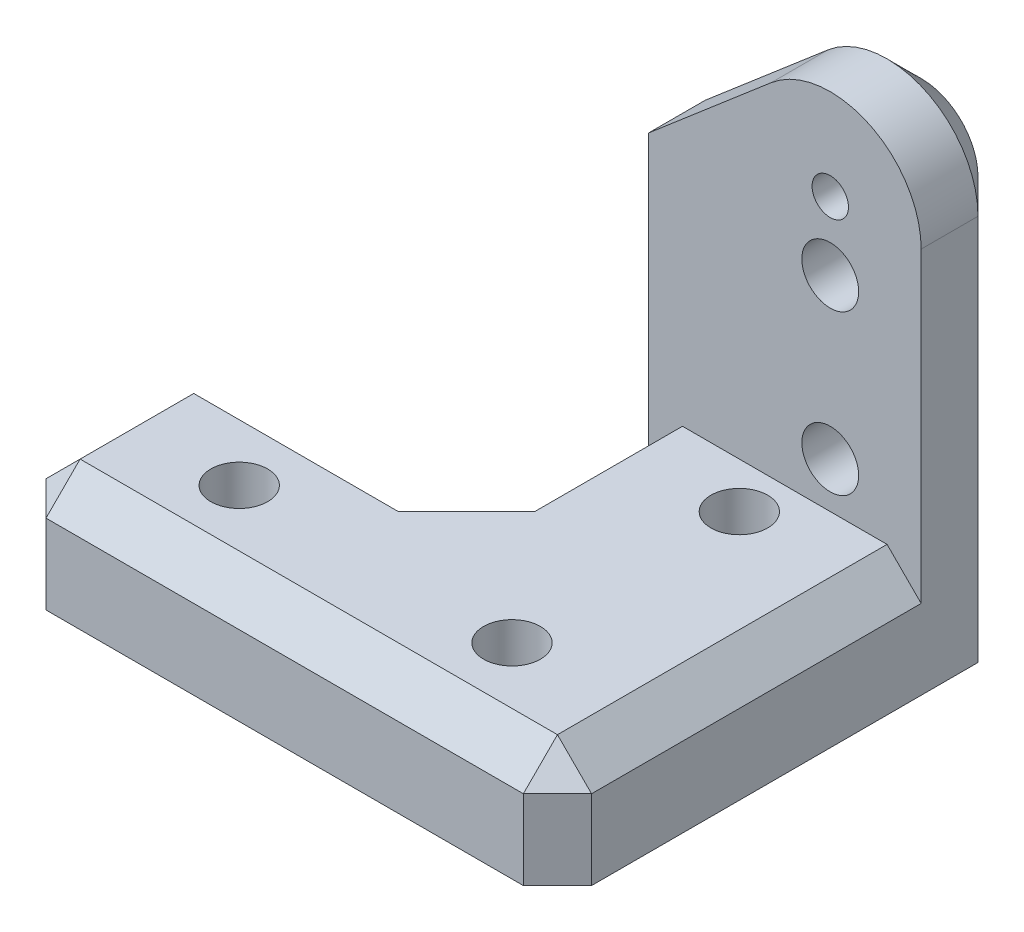
ISO-10303-21;
HEADER;
FILE_DESCRIPTION(('STEP AP214'),'2;1');
FILE_NAME('part.step','',(''),(''),'','','');
FILE_SCHEMA(('AUTOMOTIVE_DESIGN { 1 0 10303 214 1 1 1 1 }'));
ENDSEC;
DATA;
#1=APPLICATION_CONTEXT('core data for automotive mechanical design processes');
#2=APPLICATION_PROTOCOL_DEFINITION('international standard','automotive_design',2000,#1);
#3=PRODUCT_CONTEXT('',#1,'mechanical');
#4=PRODUCT('Part','Part','',(#3));
#5=PRODUCT_RELATED_PRODUCT_CATEGORY('part','',(#4));
#6=PRODUCT_DEFINITION_FORMATION('','',#4);
#7=PRODUCT_DEFINITION_CONTEXT('part definition',#1,'design');
#8=PRODUCT_DEFINITION('design','',#6,#7);
#9=PRODUCT_DEFINITION_SHAPE('','',#8);
#10=(LENGTH_UNIT() NAMED_UNIT(*) SI_UNIT(.MILLI.,.METRE.));
#11=(NAMED_UNIT(*) PLANE_ANGLE_UNIT() SI_UNIT($,.RADIAN.));
#12=(NAMED_UNIT(*) SI_UNIT($,.STERADIAN.) SOLID_ANGLE_UNIT());
#13=UNCERTAINTY_MEASURE_WITH_UNIT(LENGTH_MEASURE(1.E-05),#10,'distance_accuracy_value','');
#14=(GEOMETRIC_REPRESENTATION_CONTEXT(3) GLOBAL_UNCERTAINTY_ASSIGNED_CONTEXT((#13)) GLOBAL_UNIT_ASSIGNED_CONTEXT((#10,
#11,#12)) REPRESENTATION_CONTEXT('',''));
#15=CARTESIAN_POINT('',(0.,0.,0.));
#16=DIRECTION('',(0.,0.,1.));
#17=DIRECTION('',(1.,0.,0.));
#18=AXIS2_PLACEMENT_3D('',#15,#16,#17);
#19=CARTESIAN_POINT('',(4.,0.,0.));
#20=DIRECTION('',(1.,0.,0.));
#21=DIRECTION('',(0.,0.,-1.));
#22=AXIS2_PLACEMENT_3D('',#19,#20,#21);
#23=PLANE('',#22);
#24=DIRECTION('',(0.,0.,1.));
#25=VECTOR('',#24,1.);
#26=CARTESIAN_POINT('',(4.,0.,0.));
#27=LINE('',#26,#25);
#28=CARTESIAN_POINT('',(4.,0.,1.50000000000001));
#29=VERTEX_POINT('',#28);
#30=CARTESIAN_POINT('',(4.,0.,10.5));
#31=VERTEX_POINT('',#30);
#32=EDGE_CURVE('E192',#29,#31,#27,.T.);
#33=ORIENTED_EDGE('',*,*,#32,.T.);
#34=DIRECTION('',(0.,1.,0.));
#35=VECTOR('',#34,1.);
#36=CARTESIAN_POINT('',(4.,5.,10.5));
#37=LINE('',#36,#35);
#38=CARTESIAN_POINT('',(4.,3.49999999999999,10.5));
#39=VERTEX_POINT('',#38);
#40=EDGE_CURVE('E292',#31,#39,#37,.T.);
#41=ORIENTED_EDGE('',*,*,#40,.T.);
#42=DIRECTION('',(0.,0.,-1.));
#43=VECTOR('',#42,1.);
#44=CARTESIAN_POINT('',(4.,3.49999999999999,0.));
#45=LINE('',#44,#43);
#46=CARTESIAN_POINT('',(4.,3.49999999999999,4.));
#47=VERTEX_POINT('',#46);
#48=EDGE_CURVE('E197',#39,#47,#45,.T.);
#49=ORIENTED_EDGE('',*,*,#48,.T.);
#50=DIRECTION('',(0.,-1.,0.));
#51=VECTOR('',#50,1.);
#52=CARTESIAN_POINT('',(4.,5.,4.));
#53=LINE('',#52,#51);
#54=CARTESIAN_POINT('',(4.,15.4211646096066,4.));
#55=VERTEX_POINT('',#54);
#56=EDGE_CURVE('E191',#55,#47,#53,.T.);
#57=ORIENTED_EDGE('',*,*,#56,.F.);
#58=DIRECTION('',(0.,0.,1.));
#59=VECTOR('',#58,1.);
#60=CARTESIAN_POINT('',(4.,15.4211646096066,0.));
#61=LINE('',#60,#59);
#62=CARTESIAN_POINT('',(4.,15.4211646096066,1.50000000000001));
#63=VERTEX_POINT('',#62);
#64=EDGE_CURVE('E179',#63,#55,#61,.T.);
#65=ORIENTED_EDGE('',*,*,#64,.F.);
#66=DIRECTION('',(0.,-1.,0.));
#67=VECTOR('',#66,1.);
#68=CARTESIAN_POINT('',(4.,0.,1.50000000000001));
#69=LINE('',#68,#67);
#70=EDGE_CURVE('E249',#63,#29,#69,.T.);
#71=ORIENTED_EDGE('',*,*,#70,.T.);
#72=EDGE_LOOP('',(#33,#41,#49,#57,#65,#71));
#73=FACE_BOUND('',#72,.T.);
#74=ADVANCED_FACE('F45',(#73),#23,.F.);
#75=CARTESIAN_POINT('',(16.,0.,20.));
#76=DIRECTION('',(0.,1.,0.));
#77=DIRECTION('',(0.,0.,1.));
#78=AXIS2_PLACEMENT_3D('',#75,#76,#77);
#79=PLANE('',#78);
#80=CARTESIAN_POINT('',(10.,0.,6.));
#81=DIRECTION('',(0.,-1.,0.));
#82=DIRECTION('',(0.,0.,-1.));
#83=AXIS2_PLACEMENT_3D('',#80,#81,#82);
#84=CIRCLE('',#83,1.25);
#85=CARTESIAN_POINT('',(10.,0.,4.75));
#86=VERTEX_POINT('',#85);
#87=EDGE_CURVE('E935',#86,#86,#84,.T.);
#88=ORIENTED_EDGE('',*,*,#87,.F.);
#89=EDGE_LOOP('',(#88));
#90=FACE_BOUND('',#89,.T.);
#91=CARTESIAN_POINT('',(10.,0.,16.));
#92=DIRECTION('',(0.,-1.,0.));
#93=DIRECTION('',(0.,0.,-1.));
#94=AXIS2_PLACEMENT_3D('',#91,#92,#93);
#95=CIRCLE('',#94,1.25);
#96=CARTESIAN_POINT('',(10.,0.,14.75));
#97=VERTEX_POINT('',#96);
#98=EDGE_CURVE('E943',#97,#97,#95,.T.);
#99=ORIENTED_EDGE('',*,*,#98,.F.);
#100=EDGE_LOOP('',(#99));
#101=FACE_BOUND('',#100,.T.);
#102=CARTESIAN_POINT('',(-2.,0.,16.));
#103=DIRECTION('',(0.,-1.,0.));
#104=DIRECTION('',(0.,0.,-1.));
#105=AXIS2_PLACEMENT_3D('',#102,#103,#104);
#106=CIRCLE('',#105,1.25);
#107=CARTESIAN_POINT('',(-2.,0.,14.75));
#108=VERTEX_POINT('',#107);
#109=EDGE_CURVE('E437',#108,#108,#106,.T.);
#110=ORIENTED_EDGE('',*,*,#109,.F.);
#111=EDGE_LOOP('',(#110));
#112=FACE_BOUND('',#111,.T.);
#113=DIRECTION('',(0.,0.,1.));
#114=VECTOR('',#113,1.);
#115=CARTESIAN_POINT('',(-8.,0.,12.));
#116=LINE('',#115,#114);
#117=CARTESIAN_POINT('',(-8.,0.,13.5));
#118=VERTEX_POINT('',#117);
#119=CARTESIAN_POINT('',(-8.,0.,18.5));
#120=VERTEX_POINT('',#119);
#121=EDGE_CURVE('E280',#118,#120,#116,.T.);
#122=ORIENTED_EDGE('',*,*,#121,.F.);
#123=DIRECTION('',(0.707106781186548,0.,-0.707106781186547));
#124=VECTOR('',#123,1.);
#125=CARTESIAN_POINT('',(-8.,0.,13.5));
#126=LINE('',#125,#124);
#127=CARTESIAN_POINT('',(-6.49999999999999,0.,12.));
#128=VERTEX_POINT('',#127);
#129=EDGE_CURVE('E310',#118,#128,#126,.T.);
#130=ORIENTED_EDGE('',*,*,#129,.T.);
#131=DIRECTION('',(1.,0.,0.));
#132=VECTOR('',#131,1.);
#133=CARTESIAN_POINT('',(-8.,0.,12.));
#134=LINE('',#133,#132);
#135=CARTESIAN_POINT('',(2.5,0.,12.));
#136=VERTEX_POINT('',#135);
#137=EDGE_CURVE('E431',#128,#136,#134,.T.);
#138=ORIENTED_EDGE('',*,*,#137,.T.);
#139=DIRECTION('',(-0.707106781186547,0.,0.707106781186548));
#140=VECTOR('',#139,1.);
#141=CARTESIAN_POINT('',(5.24999999999998,0.,9.25000000000001));
#142=LINE('',#141,#140);
#143=EDGE_CURVE('E349',#136,#31,#142,.F.);
#144=ORIENTED_EDGE('',*,*,#143,.T.);
#145=ORIENTED_EDGE('',*,*,#32,.F.);
#146=DIRECTION('',(0.707106781186548,0.,-0.707106781186547));
#147=VECTOR('',#146,1.);
#148=CARTESIAN_POINT('',(5.50000000000001,0.,0.));
#149=LINE('',#148,#147);
#150=CARTESIAN_POINT('',(5.50000000000001,0.,0.));
#151=VERTEX_POINT('',#150);
#152=EDGE_CURVE('E256',#29,#151,#149,.T.);
#153=ORIENTED_EDGE('',*,*,#152,.T.);
#154=DIRECTION('',(1.,0.,0.));
#155=VECTOR('',#154,1.);
#156=CARTESIAN_POINT('',(16.,0.,0.));
#157=LINE('',#156,#155);
#158=CARTESIAN_POINT('',(14.5,0.,0.));
#159=VERTEX_POINT('',#158);
#160=EDGE_CURVE('E212',#151,#159,#157,.T.);
#161=ORIENTED_EDGE('',*,*,#160,.T.);
#162=DIRECTION('',(0.707106781186548,0.,0.707106781186547));
#163=VECTOR('',#162,1.);
#164=CARTESIAN_POINT('',(16.,0.,1.50000000000001));
#165=LINE('',#164,#163);
#166=CARTESIAN_POINT('',(16.,0.,1.50000000000001));
#167=VERTEX_POINT('',#166);
#168=EDGE_CURVE('E252',#159,#167,#165,.T.);
#169=ORIENTED_EDGE('',*,*,#168,.T.);
#170=DIRECTION('',(0.,0.,-1.));
#171=VECTOR('',#170,1.);
#172=CARTESIAN_POINT('',(16.,0.,20.));
#173=LINE('',#172,#171);
#174=CARTESIAN_POINT('',(16.,0.,18.5));
#175=VERTEX_POINT('',#174);
#176=EDGE_CURVE('E233',#175,#167,#173,.T.);
#177=ORIENTED_EDGE('',*,*,#176,.F.);
#178=DIRECTION('',(0.707106781186547,0.,-0.707106781186548));
#179=VECTOR('',#178,1.);
#180=CARTESIAN_POINT('',(14.5,0.,20.));
#181=LINE('',#180,#179);
#182=CARTESIAN_POINT('',(14.5,0.,20.));
#183=VERTEX_POINT('',#182);
#184=EDGE_CURVE('E304',#175,#183,#181,.F.);
#185=ORIENTED_EDGE('',*,*,#184,.T.);
#186=DIRECTION('',(1.,0.,0.));
#187=VECTOR('',#186,1.);
#188=CARTESIAN_POINT('',(16.,0.,20.));
#189=LINE('',#188,#187);
#190=CARTESIAN_POINT('',(-6.49999999999999,0.,20.));
#191=VERTEX_POINT('',#190);
#192=EDGE_CURVE('E219',#191,#183,#189,.T.);
#193=ORIENTED_EDGE('',*,*,#192,.F.);
#194=DIRECTION('',(-0.707106781186548,0.,-0.707106781186547));
#195=VECTOR('',#194,1.);
#196=CARTESIAN_POINT('',(-8.,0.,18.5));
#197=LINE('',#196,#195);
#198=EDGE_CURVE('E307',#191,#120,#197,.T.);
#199=ORIENTED_EDGE('',*,*,#198,.T.);
#200=EDGE_LOOP('',(#122,#130,#138,#144,#145,#153,#161,#169,#177,#185,#193,#199));
#201=FACE_BOUND('',#200,.T.);
#202=ADVANCED_FACE('F425',(#90,#101,#112,#201),#79,.F.);
#203=CARTESIAN_POINT('',(16.,17.,20.));
#204=DIRECTION('',(-1.,0.,0.));
#205=DIRECTION('',(0.,0.,1.));
#206=AXIS2_PLACEMENT_3D('',#203,#204,#205);
#207=PLANE('',#206);
#208=DIRECTION('',(0.,-1.,0.));
#209=VECTOR('',#208,1.);
#210=CARTESIAN_POINT('',(16.,5.,4.));
#211=LINE('',#210,#209);
#212=CARTESIAN_POINT('',(16.,17.,4.));
#213=VERTEX_POINT('',#212);
#214=CARTESIAN_POINT('',(16.,3.49999999999999,4.));
#215=VERTEX_POINT('',#214);
#216=EDGE_CURVE('E215',#213,#215,#211,.T.);
#217=ORIENTED_EDGE('',*,*,#216,.T.);
#218=DIRECTION('',(0.,0.,1.));
#219=VECTOR('',#218,1.);
#220=CARTESIAN_POINT('',(16.,3.49999999999999,20.));
#221=LINE('',#220,#219);
#222=CARTESIAN_POINT('',(16.,3.49999999999999,18.5));
#223=VERTEX_POINT('',#222);
#224=EDGE_CURVE('E325',#215,#223,#221,.T.);
#225=ORIENTED_EDGE('',*,*,#224,.T.);
#226=DIRECTION('',(0.,-1.,0.));
#227=VECTOR('',#226,1.);
#228=CARTESIAN_POINT('',(16.,17.,18.5));
#229=LINE('',#228,#227);
#230=EDGE_CURVE('E322',#223,#175,#229,.T.);
#231=ORIENTED_EDGE('',*,*,#230,.T.);
#232=ORIENTED_EDGE('',*,*,#176,.T.);
#233=DIRECTION('',(0.,1.,0.));
#234=VECTOR('',#233,1.);
#235=CARTESIAN_POINT('',(16.,17.,1.50000000000001));
#236=LINE('',#235,#234);
#237=CARTESIAN_POINT('',(16.,17.,1.50000000000001));
#238=VERTEX_POINT('',#237);
#239=EDGE_CURVE('E264',#167,#238,#236,.T.);
#240=ORIENTED_EDGE('',*,*,#239,.T.);
#241=DIRECTION('',(0.,0.,-1.));
#242=VECTOR('',#241,1.);
#243=CARTESIAN_POINT('',(16.,17.,20.));
#244=LINE('',#243,#242);
#245=EDGE_CURVE('E229',#213,#238,#244,.T.);
#246=ORIENTED_EDGE('',*,*,#245,.F.);
#247=EDGE_LOOP('',(#217,#225,#231,#232,#240,#246));
#248=FACE_BOUND('',#247,.T.);
#249=ADVANCED_FACE('F451',(#248),#207,.F.);
#250=CARTESIAN_POINT('',(12.,17.,20.));
#251=DIRECTION('',(0.,0.,-1.));
#252=DIRECTION('',(-1.,0.,0.));
#253=AXIS2_PLACEMENT_3D('',#250,#251,#252);
#254=CYLINDRICAL_SURFACE('',#253,4.);
#255=ORIENTED_EDGE('',*,*,#245,.T.);
#256=CARTESIAN_POINT('',(12.,17.,1.50000000000001));
#257=DIRECTION('',(0.,0.,-1.));
#258=DIRECTION('',(-1.,0.,0.));
#259=AXIS2_PLACEMENT_3D('',#256,#257,#258);
#260=CIRCLE('',#259,4.);
#261=CARTESIAN_POINT('',(9.40008084297598,20.0398059768577,1.50000000000001));
#262=VERTEX_POINT('',#261);
#263=EDGE_CURVE('E261',#238,#262,#260,.F.);
#264=ORIENTED_EDGE('',*,*,#263,.T.);
#265=DIRECTION('',(0.,0.,-1.));
#266=VECTOR('',#265,1.);
#267=CARTESIAN_POINT('',(9.40008084297598,20.0398059768577,20.));
#268=LINE('',#267,#266);
#269=CARTESIAN_POINT('',(9.40008084297598,20.0398059768577,4.));
#270=VERTEX_POINT('',#269);
#271=EDGE_CURVE('E223',#270,#262,#268,.T.);
#272=ORIENTED_EDGE('',*,*,#271,.F.);
#273=CARTESIAN_POINT('',(12.,17.,4.));
#274=DIRECTION('',(0.,0.,-1.));
#275=DIRECTION('',(-1.,0.,0.));
#276=AXIS2_PLACEMENT_3D('',#273,#274,#275);
#277=CIRCLE('',#276,4.);
#278=EDGE_CURVE('E205',#270,#213,#277,.T.);
#279=ORIENTED_EDGE('',*,*,#278,.T.);
#280=EDGE_LOOP('',(#255,#264,#272,#279));
#281=FACE_BOUND('',#280,.T.);
#282=ADVANCED_FACE('F496',(#281),#254,.T.);
#283=CARTESIAN_POINT('',(0.,12.,20.));
#284=DIRECTION('',(0.649979789256005,-0.759951494214413,0.));
#285=DIRECTION('',(0.759951494214413,0.649979789256005,0.));
#286=AXIS2_PLACEMENT_3D('',#283,#284,#285);
#287=PLANE('',#286);
#288=ORIENTED_EDGE('',*,*,#271,.T.);
#289=DIRECTION('',(-0.759951494214413,-0.649979789256005,0.));
#290=VECTOR('',#289,1.);
#291=CARTESIAN_POINT('',(4.,15.4211646096066,1.50000000000001));
#292=LINE('',#291,#290);
#293=EDGE_CURVE('E187',#262,#63,#292,.T.);
#294=ORIENTED_EDGE('',*,*,#293,.T.);
#295=ORIENTED_EDGE('',*,*,#64,.T.);
#296=DIRECTION('',(0.759951494214413,0.649979789256005,0.));
#297=VECTOR('',#296,1.);
#298=CARTESIAN_POINT('',(0.,12.,4.));
#299=LINE('',#298,#297);
#300=EDGE_CURVE('E184',#55,#270,#299,.T.);
#301=ORIENTED_EDGE('',*,*,#300,.T.);
#302=EDGE_LOOP('',(#288,#294,#295,#301));
#303=FACE_BOUND('',#302,.T.);
#304=ADVANCED_FACE('F182',(#303),#287,.F.);
#305=CARTESIAN_POINT('',(12.,17.,20.));
#306=DIRECTION('',(0.,0.,-1.));
#307=DIRECTION('',(-1.,0.,0.));
#308=AXIS2_PLACEMENT_3D('',#305,#306,#307);
#309=PLANE('',#308);
#310=DIRECTION('',(-1.,0.,0.));
#311=VECTOR('',#310,1.);
#312=CARTESIAN_POINT('',(12.,3.49999999999999,20.));
#313=LINE('',#312,#311);
#314=CARTESIAN_POINT('',(14.5,3.49999999999999,20.));
#315=VERTEX_POINT('',#314);
#316=CARTESIAN_POINT('',(-6.49999999999999,3.49999999999999,20.));
#317=VERTEX_POINT('',#316);
#318=EDGE_CURVE('E313',#315,#317,#313,.T.);
#319=ORIENTED_EDGE('',*,*,#318,.T.);
#320=DIRECTION('',(0.,-1.,0.));
#321=VECTOR('',#320,1.);
#322=CARTESIAN_POINT('',(-6.49999999999999,0.,20.));
#323=LINE('',#322,#321);
#324=EDGE_CURVE('E319',#317,#191,#323,.T.);
#325=ORIENTED_EDGE('',*,*,#324,.T.);
#326=ORIENTED_EDGE('',*,*,#192,.T.);
#327=DIRECTION('',(0.,1.,0.));
#328=VECTOR('',#327,1.);
#329=CARTESIAN_POINT('',(14.5,17.,20.));
#330=LINE('',#329,#328);
#331=EDGE_CURVE('E316',#183,#315,#330,.T.);
#332=ORIENTED_EDGE('',*,*,#331,.T.);
#333=EDGE_LOOP('',(#319,#325,#326,#332));
#334=FACE_BOUND('',#333,.T.);
#335=ADVANCED_FACE('F413',(#334),#309,.F.);
#336=CARTESIAN_POINT('',(12.,17.,0.));
#337=DIRECTION('',(0.,0.,-1.));
#338=DIRECTION('',(-1.,0.,0.));
#339=AXIS2_PLACEMENT_3D('',#336,#337,#338);
#340=PLANE('',#339);
#341=CARTESIAN_POINT('',(12.,7.,0.));
#342=DIRECTION('',(0.,0.,-1.));
#343=DIRECTION('',(-1.,0.,0.));
#344=AXIS2_PLACEMENT_3D('',#341,#342,#343);
#345=CIRCLE('',#344,1.25);
#346=CARTESIAN_POINT('',(10.75,7.,0.));
#347=VERTEX_POINT('',#346);
#348=EDGE_CURVE('E921',#347,#347,#345,.T.);
#349=ORIENTED_EDGE('',*,*,#348,.F.);
#350=EDGE_LOOP('',(#349));
#351=FACE_BOUND('',#350,.T.);
#352=CARTESIAN_POINT('',(12.,14.,0.));
#353=DIRECTION('',(0.,0.,-1.));
#354=DIRECTION('',(-1.,0.,0.));
#355=AXIS2_PLACEMENT_3D('',#352,#353,#354);
#356=CIRCLE('',#355,1.25);
#357=CARTESIAN_POINT('',(10.75,14.,0.));
#358=VERTEX_POINT('',#357);
#359=EDGE_CURVE('E925',#358,#358,#356,.T.);
#360=ORIENTED_EDGE('',*,*,#359,.F.);
#361=EDGE_LOOP('',(#360));
#362=FACE_BOUND('',#361,.T.);
#363=ORIENTED_EDGE('',*,*,#160,.F.);
#364=DIRECTION('',(0.,1.,0.));
#365=VECTOR('',#364,1.);
#366=CARTESIAN_POINT('',(5.50000000000001,15.4211646096066,0.));
#367=LINE('',#366,#365);
#368=CARTESIAN_POINT('',(5.50000000000001,14.7302911524017,0.));
#369=VERTEX_POINT('',#368);
#370=EDGE_CURVE('E245',#151,#369,#367,.T.);
#371=ORIENTED_EDGE('',*,*,#370,.T.);
#372=DIRECTION('',(0.759951494214413,0.649979789256005,0.));
#373=VECTOR('',#372,1.);
#374=CARTESIAN_POINT('',(10.37505052686,18.899878735536,0.));
#375=LINE('',#374,#373);
#376=CARTESIAN_POINT('',(10.37505052686,18.899878735536,0.));
#377=VERTEX_POINT('',#376);
#378=EDGE_CURVE('E242',#369,#377,#375,.T.);
#379=ORIENTED_EDGE('',*,*,#378,.T.);
#380=CARTESIAN_POINT('',(12.,17.,0.));
#381=DIRECTION('',(0.,0.,-1.));
#382=DIRECTION('',(-1.,0.,0.));
#383=AXIS2_PLACEMENT_3D('',#380,#381,#382);
#384=CIRCLE('',#383,2.49999999999999);
#385=CARTESIAN_POINT('',(14.5,17.,0.));
#386=VERTEX_POINT('',#385);
#387=EDGE_CURVE('E239',#377,#386,#384,.T.);
#388=ORIENTED_EDGE('',*,*,#387,.T.);
#389=DIRECTION('',(0.,-1.,0.));
#390=VECTOR('',#389,1.);
#391=CARTESIAN_POINT('',(14.5,0.,0.));
#392=LINE('',#391,#390);
#393=EDGE_CURVE('E236',#386,#159,#392,.T.);
#394=ORIENTED_EDGE('',*,*,#393,.T.);
#395=EDGE_LOOP('',(#363,#371,#379,#388,#394));
#396=FACE_BOUND('',#395,.T.);
#397=CARTESIAN_POINT('',(12.,17.,0.));
#398=DIRECTION('',(0.,0.,-1.));
#399=DIRECTION('',(-1.,0.,0.));
#400=AXIS2_PLACEMENT_3D('',#397,#398,#399);
#401=CIRCLE('',#400,0.799999999999999);
#402=CARTESIAN_POINT('',(11.2,17.,0.));
#403=VERTEX_POINT('',#402);
#404=EDGE_CURVE('E445',#403,#403,#401,.T.);
#405=ORIENTED_EDGE('',*,*,#404,.F.);
#406=EDGE_LOOP('',(#405));
#407=FACE_BOUND('',#406,.T.);
#408=ADVANCED_FACE('F487',(#351,#362,#396,#407),#340,.T.);
#409=CARTESIAN_POINT('',(16.,5.,4.));
#410=DIRECTION('',(0.,0.,-1.));
#411=DIRECTION('',(-1.,0.,0.));
#412=AXIS2_PLACEMENT_3D('',#409,#410,#411);
#413=PLANE('',#412);
#414=CARTESIAN_POINT('',(12.,7.,4.));
#415=DIRECTION('',(0.,0.,-1.));
#416=DIRECTION('',(-1.,0.,0.));
#417=AXIS2_PLACEMENT_3D('',#414,#415,#416);
#418=CIRCLE('',#417,1.25);
#419=CARTESIAN_POINT('',(10.75,7.,4.));
#420=VERTEX_POINT('',#419);
#421=EDGE_CURVE('E918',#420,#420,#418,.T.);
#422=ORIENTED_EDGE('',*,*,#421,.T.);
#423=EDGE_LOOP('',(#422));
#424=FACE_BOUND('',#423,.T.);
#425=CARTESIAN_POINT('',(12.,14.,4.));
#426=DIRECTION('',(0.,0.,-1.));
#427=DIRECTION('',(-1.,0.,0.));
#428=AXIS2_PLACEMENT_3D('',#425,#426,#427);
#429=CIRCLE('',#428,1.25);
#430=CARTESIAN_POINT('',(10.75,14.,4.));
#431=VERTEX_POINT('',#430);
#432=EDGE_CURVE('E931',#431,#431,#429,.T.);
#433=ORIENTED_EDGE('',*,*,#432,.T.);
#434=EDGE_LOOP('',(#433));
#435=FACE_BOUND('',#434,.T.);
#436=CARTESIAN_POINT('',(12.,17.,4.));
#437=DIRECTION('',(0.,0.,1.));
#438=DIRECTION('',(1.,0.,0.));
#439=AXIS2_PLACEMENT_3D('',#436,#437,#438);
#440=CIRCLE('',#439,0.799999999999999);
#441=CARTESIAN_POINT('',(12.8,17.,4.));
#442=VERTEX_POINT('',#441);
#443=EDGE_CURVE('E201',#442,#442,#440,.T.);
#444=ORIENTED_EDGE('',*,*,#443,.F.);
#445=EDGE_LOOP('',(#444));
#446=FACE_BOUND('',#445,.T.);
#447=ORIENTED_EDGE('',*,*,#300,.F.);
#448=ORIENTED_EDGE('',*,*,#56,.T.);
#449=DIRECTION('',(-0.707106781186547,-0.707106781186548,0.));
#450=VECTOR('',#449,1.);
#451=CARTESIAN_POINT('',(10.75,10.25,4.));
#452=LINE('',#451,#450);
#453=CARTESIAN_POINT('',(5.50000000000001,5.,4.));
#454=VERTEX_POINT('',#453);
#455=EDGE_CURVE('E11',#47,#454,#452,.F.);
#456=ORIENTED_EDGE('',*,*,#455,.T.);
#457=DIRECTION('',(-1.,0.,0.));
#458=VECTOR('',#457,1.);
#459=CARTESIAN_POINT('',(16.,5.,4.));
#460=LINE('',#459,#458);
#461=CARTESIAN_POINT('',(14.5,5.,4.));
#462=VERTEX_POINT('',#461);
#463=EDGE_CURVE('E208',#462,#454,#460,.T.);
#464=ORIENTED_EDGE('',*,*,#463,.F.);
#465=DIRECTION('',(-0.707106781186547,0.707106781186548,0.));
#466=VECTOR('',#465,1.);
#467=CARTESIAN_POINT('',(15.25,4.25,4.));
#468=LINE('',#467,#466);
#469=EDGE_CURVE('E56',#462,#215,#468,.F.);
#470=ORIENTED_EDGE('',*,*,#469,.T.);
#471=ORIENTED_EDGE('',*,*,#216,.F.);
#472=ORIENTED_EDGE('',*,*,#278,.F.);
#473=EDGE_LOOP('',(#447,#448,#456,#464,#470,#471,#472));
#474=FACE_BOUND('',#473,.T.);
#475=ADVANCED_FACE('F203',(#424,#435,#446,#474),#413,.F.);
#476=CARTESIAN_POINT('',(16.,5.,20.));
#477=DIRECTION('',(0.,-1.,0.));
#478=DIRECTION('',(0.,0.,-1.));
#479=AXIS2_PLACEMENT_3D('',#476,#477,#478);
#480=PLANE('',#479);
#481=CARTESIAN_POINT('',(10.,5.,6.));
#482=DIRECTION('',(0.,-1.,0.));
#483=DIRECTION('',(0.,0.,-1.));
#484=AXIS2_PLACEMENT_3D('',#481,#482,#483);
#485=CIRCLE('',#484,1.25);
#486=CARTESIAN_POINT('',(10.,5.,4.75));
#487=VERTEX_POINT('',#486);
#488=EDGE_CURVE('E939',#487,#487,#485,.T.);
#489=ORIENTED_EDGE('',*,*,#488,.T.);
#490=EDGE_LOOP('',(#489));
#491=FACE_BOUND('',#490,.T.);
#492=CARTESIAN_POINT('',(10.,5.,16.));
#493=DIRECTION('',(0.,-1.,0.));
#494=DIRECTION('',(0.,0.,-1.));
#495=AXIS2_PLACEMENT_3D('',#492,#493,#494);
#496=CIRCLE('',#495,1.25);
#497=CARTESIAN_POINT('',(10.,5.,14.75));
#498=VERTEX_POINT('',#497);
#499=EDGE_CURVE('E946',#498,#498,#496,.T.);
#500=ORIENTED_EDGE('',*,*,#499,.T.);
#501=EDGE_LOOP('',(#500));
#502=FACE_BOUND('',#501,.T.);
#503=CARTESIAN_POINT('',(-2.,5.,16.));
#504=DIRECTION('',(0.,-1.,0.));
#505=DIRECTION('',(0.,0.,-1.));
#506=AXIS2_PLACEMENT_3D('',#503,#504,#505);
#507=CIRCLE('',#506,1.25);
#508=CARTESIAN_POINT('',(-2.,5.,14.75));
#509=VERTEX_POINT('',#508);
#510=EDGE_CURVE('E50',#509,#509,#507,.T.);
#511=ORIENTED_EDGE('',*,*,#510,.T.);
#512=EDGE_LOOP('',(#511));
#513=FACE_BOUND('',#512,.T.);
#514=DIRECTION('',(1.,0.,0.));
#515=VECTOR('',#514,1.);
#516=CARTESIAN_POINT('',(16.,5.,18.5));
#517=LINE('',#516,#515);
#518=CARTESIAN_POINT('',(-6.5,5.,18.5));
#519=VERTEX_POINT('',#518);
#520=CARTESIAN_POINT('',(14.5,5.,18.5));
#521=VERTEX_POINT('',#520);
#522=EDGE_CURVE('E64',#519,#521,#517,.T.);
#523=ORIENTED_EDGE('',*,*,#522,.T.);
#524=DIRECTION('',(0.,0.,-1.));
#525=VECTOR('',#524,1.);
#526=CARTESIAN_POINT('',(14.5,5.,20.));
#527=LINE('',#526,#525);
#528=EDGE_CURVE('E346',#521,#462,#527,.T.);
#529=ORIENTED_EDGE('',*,*,#528,.T.);
#530=ORIENTED_EDGE('',*,*,#463,.T.);
#531=DIRECTION('',(0.,0.,1.));
#532=VECTOR('',#531,1.);
#533=CARTESIAN_POINT('',(5.50000000000001,5.,20.));
#534=LINE('',#533,#532);
#535=CARTESIAN_POINT('',(5.50000000000001,5.,10.5));
#536=VERTEX_POINT('',#535);
#537=EDGE_CURVE('E336',#454,#536,#534,.T.);
#538=ORIENTED_EDGE('',*,*,#537,.T.);
#539=DIRECTION('',(0.707106781186547,0.,-0.707106781186548));
#540=VECTOR('',#539,1.);
#541=CARTESIAN_POINT('',(5.50000000000001,5.,10.5));
#542=LINE('',#541,#540);
#543=CARTESIAN_POINT('',(4.,5.,12.));
#544=VERTEX_POINT('',#543);
#545=EDGE_CURVE('E328',#544,#536,#542,.T.);
#546=ORIENTED_EDGE('',*,*,#545,.F.);
#547=DIRECTION('',(0.707106781186547,0.,-0.707106781186548));
#548=VECTOR('',#547,1.);
#549=CARTESIAN_POINT('',(5.50000000000001,5.,10.5));
#550=LINE('',#549,#548);
#551=CARTESIAN_POINT('',(2.5,5.,13.5));
#552=VERTEX_POINT('',#551);
#553=EDGE_CURVE('E332',#552,#544,#550,.T.);
#554=ORIENTED_EDGE('',*,*,#553,.F.);
#555=DIRECTION('',(-1.,0.,0.));
#556=VECTOR('',#555,1.);
#557=CARTESIAN_POINT('',(16.,5.,13.5));
#558=LINE('',#557,#556);
#559=CARTESIAN_POINT('',(-6.5,5.,13.5));
#560=VERTEX_POINT('',#559);
#561=EDGE_CURVE('E339',#552,#560,#558,.T.);
#562=ORIENTED_EDGE('',*,*,#561,.T.);
#563=DIRECTION('',(0.,0.,1.));
#564=VECTOR('',#563,1.);
#565=CARTESIAN_POINT('',(-6.5,5.,20.));
#566=LINE('',#565,#564);
#567=EDGE_CURVE('E69',#560,#519,#566,.T.);
#568=ORIENTED_EDGE('',*,*,#567,.T.);
#569=EDGE_LOOP('',(#523,#529,#530,#538,#546,#554,#562,#568));
#570=FACE_BOUND('',#569,.T.);
#571=ADVANCED_FACE('F480',(#491,#502,#513,#570),#480,.F.);
#572=CARTESIAN_POINT('',(12.,17.,4.));
#573=DIRECTION('',(0.,0.,1.));
#574=DIRECTION('',(1.,0.,0.));
#575=AXIS2_PLACEMENT_3D('',#572,#573,#574);
#576=CYLINDRICAL_SURFACE('',#575,0.799999999999999);
#577=ORIENTED_EDGE('',*,*,#404,.T.);
#578=EDGE_LOOP('',(#577));
#579=FACE_BOUND('',#578,.T.);
#580=ORIENTED_EDGE('',*,*,#443,.T.);
#581=EDGE_LOOP('',(#580));
#582=FACE_BOUND('',#581,.T.);
#583=ADVANCED_FACE('F477',(#579,#582),#576,.F.);
#584=CARTESIAN_POINT('',(-8.,5.,12.));
#585=DIRECTION('',(0.,0.,1.));
#586=DIRECTION('',(1.,0.,0.));
#587=AXIS2_PLACEMENT_3D('',#584,#585,#586);
#588=PLANE('',#587);
#589=DIRECTION('',(1.,0.,0.));
#590=VECTOR('',#589,1.);
#591=CARTESIAN_POINT('',(-8.,3.49999999999999,12.));
#592=LINE('',#591,#590);
#593=CARTESIAN_POINT('',(-6.49999999999999,3.49999999999999,12.));
#594=VERTEX_POINT('',#593);
#595=CARTESIAN_POINT('',(2.5,3.49999999999999,12.));
#596=VERTEX_POINT('',#595);
#597=EDGE_CURVE('E267',#594,#596,#592,.T.);
#598=ORIENTED_EDGE('',*,*,#597,.T.);
#599=DIRECTION('',(0.,-1.,0.));
#600=VECTOR('',#599,1.);
#601=CARTESIAN_POINT('',(2.5,0.,12.));
#602=LINE('',#601,#600);
#603=EDGE_CURVE('E286',#596,#136,#602,.T.);
#604=ORIENTED_EDGE('',*,*,#603,.T.);
#605=ORIENTED_EDGE('',*,*,#137,.F.);
#606=DIRECTION('',(0.,1.,0.));
#607=VECTOR('',#606,1.);
#608=CARTESIAN_POINT('',(-6.49999999999999,5.,12.));
#609=LINE('',#608,#607);
#610=EDGE_CURVE('E283',#128,#594,#609,.T.);
#611=ORIENTED_EDGE('',*,*,#610,.T.);
#612=EDGE_LOOP('',(#598,#604,#605,#611));
#613=FACE_BOUND('',#612,.T.);
#614=ADVANCED_FACE('F475',(#613),#588,.F.);
#615=CARTESIAN_POINT('',(-8.,0.,0.));
#616=DIRECTION('',(-1.,0.,0.));
#617=DIRECTION('',(0.,0.,1.));
#618=AXIS2_PLACEMENT_3D('',#615,#616,#617);
#619=PLANE('',#618);
#620=DIRECTION('',(0.,0.,-1.));
#621=VECTOR('',#620,1.);
#622=CARTESIAN_POINT('',(-8.,3.49999999999999,12.));
#623=LINE('',#622,#621);
#624=CARTESIAN_POINT('',(-8.,3.49999999999999,18.5));
#625=VERTEX_POINT('',#624);
#626=CARTESIAN_POINT('',(-8.,3.49999999999999,13.5));
#627=VERTEX_POINT('',#626);
#628=EDGE_CURVE('E295',#625,#627,#623,.T.);
#629=ORIENTED_EDGE('',*,*,#628,.T.);
#630=DIRECTION('',(0.,-1.,0.));
#631=VECTOR('',#630,1.);
#632=CARTESIAN_POINT('',(-8.,0.,13.5));
#633=LINE('',#632,#631);
#634=EDGE_CURVE('E301',#627,#118,#633,.T.);
#635=ORIENTED_EDGE('',*,*,#634,.T.);
#636=ORIENTED_EDGE('',*,*,#121,.T.);
#637=DIRECTION('',(0.,1.,0.));
#638=VECTOR('',#637,1.);
#639=CARTESIAN_POINT('',(-8.,5.,18.5));
#640=LINE('',#639,#638);
#641=EDGE_CURVE('E298',#120,#625,#640,.T.);
#642=ORIENTED_EDGE('',*,*,#641,.T.);
#643=EDGE_LOOP('',(#629,#635,#636,#642));
#644=FACE_BOUND('',#643,.T.);
#645=ADVANCED_FACE('F428',(#644),#619,.T.);
#646=CARTESIAN_POINT('',(16.,17.,1.50000000000001));
#647=DIRECTION('',(0.707106781186547,0.,-0.707106781186548));
#648=DIRECTION('',(0.,-1.,0.));
#649=AXIS2_PLACEMENT_3D('',#646,#647,#648);
#650=PLANE('',#649);
#651=ORIENTED_EDGE('',*,*,#168,.F.);
#652=ORIENTED_EDGE('',*,*,#393,.F.);
#653=DIRECTION('',(-0.707106781186548,0.,-0.707106781186547));
#654=VECTOR('',#653,1.);
#655=CARTESIAN_POINT('',(16.,17.,1.50000000000001));
#656=LINE('',#655,#654);
#657=EDGE_CURVE('E276',#238,#386,#656,.T.);
#658=ORIENTED_EDGE('',*,*,#657,.F.);
#659=ORIENTED_EDGE('',*,*,#239,.F.);
#660=EDGE_LOOP('',(#651,#652,#658,#659));
#661=FACE_BOUND('',#660,.T.);
#662=ADVANCED_FACE('F518',(#661),#650,.T.);
#663=CARTESIAN_POINT('',(12.,17.,1.50000000000001));
#664=DIRECTION('',(0.,0.,1.));
#665=DIRECTION('',(1.,0.,0.));
#666=AXIS2_PLACEMENT_3D('',#663,#664,#665);
#667=CONICAL_SURFACE('',#666,4.,0.785398163397449);
#668=ORIENTED_EDGE('',*,*,#657,.T.);
#669=ORIENTED_EDGE('',*,*,#387,.F.);
#670=DIRECTION('',(0.459605116617125,-0.537366854931862,-0.707106781186547));
#671=VECTOR('',#670,1.);
#672=CARTESIAN_POINT('',(9.40008084297598,20.0398059768577,1.50000000000001));
#673=LINE('',#672,#671);
#674=EDGE_CURVE('E271',#262,#377,#673,.T.);
#675=ORIENTED_EDGE('',*,*,#674,.F.);
#676=ORIENTED_EDGE('',*,*,#263,.F.);
#677=EDGE_LOOP('',(#668,#669,#675,#676));
#678=FACE_BOUND('',#677,.T.);
#679=ADVANCED_FACE('F511',(#678),#667,.T.);
#680=CARTESIAN_POINT('',(0.,12.,1.50000000000001));
#681=DIRECTION('',(-0.459605116617124,0.537366854931861,-0.707106781186547));
#682=DIRECTION('',(0.759951494214413,0.649979789256005,0.));
#683=AXIS2_PLACEMENT_3D('',#680,#681,#682);
#684=PLANE('',#683);
#685=ORIENTED_EDGE('',*,*,#674,.T.);
#686=ORIENTED_EDGE('',*,*,#378,.F.);
#687=DIRECTION('',(-0.672347945952809,0.309671566576716,0.672347945952808));
#688=VECTOR('',#687,1.);
#689=CARTESIAN_POINT('',(2.90410352085392,15.9259151357976,2.59589647914609));
#690=LINE('',#689,#688);
#691=EDGE_CURVE('E268',#63,#369,#690,.F.);
#692=ORIENTED_EDGE('',*,*,#691,.F.);
#693=ORIENTED_EDGE('',*,*,#293,.F.);
#694=EDGE_LOOP('',(#685,#686,#692,#693));
#695=FACE_BOUND('',#694,.T.);
#696=ADVANCED_FACE('F463',(#695),#684,.T.);
#697=CARTESIAN_POINT('',(5.50000000000001,17.,0.));
#698=DIRECTION('',(-0.707106781186547,0.,-0.707106781186548));
#699=DIRECTION('',(0.,-1.,0.));
#700=AXIS2_PLACEMENT_3D('',#697,#698,#699);
#701=PLANE('',#700);
#702=ORIENTED_EDGE('',*,*,#152,.F.);
#703=ORIENTED_EDGE('',*,*,#70,.F.);
#704=ORIENTED_EDGE('',*,*,#691,.T.);
#705=ORIENTED_EDGE('',*,*,#370,.F.);
#706=EDGE_LOOP('',(#702,#703,#704,#705));
#707=FACE_BOUND('',#706,.T.);
#708=ADVANCED_FACE('F457',(#707),#701,.T.);
#709=CARTESIAN_POINT('',(16.,3.49999999999999,20.));
#710=DIRECTION('',(-0.707106781186548,-0.707106781186547,0.));
#711=DIRECTION('',(0.,0.,1.));
#712=AXIS2_PLACEMENT_3D('',#709,#710,#711);
#713=PLANE('',#712);
#714=ORIENTED_EDGE('',*,*,#469,.F.);
#715=ORIENTED_EDGE('',*,*,#528,.F.);
#716=DIRECTION('',(0.707106781186547,-0.707106781186548,0.));
#717=VECTOR('',#716,1.);
#718=CARTESIAN_POINT('',(16.,3.49999999999999,18.5));
#719=LINE('',#718,#717);
#720=EDGE_CURVE('E272',#223,#521,#719,.F.);
#721=ORIENTED_EDGE('',*,*,#720,.F.);
#722=ORIENTED_EDGE('',*,*,#224,.F.);
#723=EDGE_LOOP('',(#714,#715,#721,#722));
#724=FACE_BOUND('',#723,.T.);
#725=ADVANCED_FACE('F48',(#724),#713,.F.);
#726=CARTESIAN_POINT('',(14.5,17.,20.));
#727=DIRECTION('',(-0.707106781186548,0.,-0.707106781186547));
#728=DIRECTION('',(0.,1.,0.));
#729=AXIS2_PLACEMENT_3D('',#726,#727,#728);
#730=PLANE('',#729);
#731=ORIENTED_EDGE('',*,*,#184,.F.);
#732=ORIENTED_EDGE('',*,*,#230,.F.);
#733=DIRECTION('',(-0.707106781186547,0.,0.707106781186548));
#734=VECTOR('',#733,1.);
#735=CARTESIAN_POINT('',(16.,3.49999999999999,18.5));
#736=LINE('',#735,#734);
#737=EDGE_CURVE('E395',#315,#223,#736,.F.);
#738=ORIENTED_EDGE('',*,*,#737,.F.);
#739=ORIENTED_EDGE('',*,*,#331,.F.);
#740=EDGE_LOOP('',(#731,#732,#738,#739));
#741=FACE_BOUND('',#740,.T.);
#742=ADVANCED_FACE('F456',(#741),#730,.F.);
#743=CARTESIAN_POINT('',(16.,3.49999999999999,18.5));
#744=DIRECTION('',(0.577350269189627,0.577350269189624,0.577350269189626));
#745=DIRECTION('',(0.707106781186547,0.,-0.707106781186548));
#746=AXIS2_PLACEMENT_3D('',#743,#744,#745);
#747=PLANE('',#746);
#748=ORIENTED_EDGE('',*,*,#737,.T.);
#749=ORIENTED_EDGE('',*,*,#720,.T.);
#750=DIRECTION('',(0.,0.707106781186548,-0.707106781186547));
#751=VECTOR('',#750,1.);
#752=CARTESIAN_POINT('',(14.5,4.25,19.25));
#753=LINE('',#752,#751);
#754=EDGE_CURVE('E391',#315,#521,#753,.T.);
#755=ORIENTED_EDGE('',*,*,#754,.F.);
#756=EDGE_LOOP('',(#748,#749,#755));
#757=FACE_BOUND('',#756,.T.);
#758=ADVANCED_FACE('F403',(#757),#747,.T.);
#759=CARTESIAN_POINT('',(12.,3.49999999999999,20.));
#760=DIRECTION('',(0.,-0.707106781186547,-0.707106781186548));
#761=DIRECTION('',(-1.,0.,0.));
#762=AXIS2_PLACEMENT_3D('',#759,#760,#761);
#763=PLANE('',#762);
#764=ORIENTED_EDGE('',*,*,#754,.T.);
#765=ORIENTED_EDGE('',*,*,#522,.F.);
#766=DIRECTION('',(0.,-0.707106781186548,0.707106781186547));
#767=VECTOR('',#766,1.);
#768=CARTESIAN_POINT('',(-6.49999999999999,4.25,19.25));
#769=LINE('',#768,#767);
#770=EDGE_CURVE('E387',#317,#519,#769,.F.);
#771=ORIENTED_EDGE('',*,*,#770,.F.);
#772=ORIENTED_EDGE('',*,*,#318,.F.);
#773=EDGE_LOOP('',(#764,#765,#771,#772));
#774=FACE_BOUND('',#773,.T.);
#775=ADVANCED_FACE('F409',(#774),#763,.F.);
#776=CARTESIAN_POINT('',(-8.,0.,18.5));
#777=DIRECTION('',(-0.707106781186547,0.,0.707106781186548));
#778=DIRECTION('',(0.,-1.,0.));
#779=AXIS2_PLACEMENT_3D('',#776,#777,#778);
#780=PLANE('',#779);
#781=ORIENTED_EDGE('',*,*,#198,.F.);
#782=ORIENTED_EDGE('',*,*,#324,.F.);
#783=DIRECTION('',(0.707106781186548,0.,0.707106781186547));
#784=VECTOR('',#783,1.);
#785=CARTESIAN_POINT('',(-8.,3.49999999999999,18.5));
#786=LINE('',#785,#784);
#787=EDGE_CURVE('E383',#625,#317,#786,.T.);
#788=ORIENTED_EDGE('',*,*,#787,.F.);
#789=ORIENTED_EDGE('',*,*,#641,.F.);
#790=EDGE_LOOP('',(#781,#782,#788,#789));
#791=FACE_BOUND('',#790,.T.);
#792=ADVANCED_FACE('F419',(#791),#780,.T.);
#793=CARTESIAN_POINT('',(-8.,3.49999999999999,18.5));
#794=DIRECTION('',(-0.577350269189626,0.577350269189624,0.577350269189627));
#795=DIRECTION('',(0.707106781186548,0.,0.707106781186547));
#796=AXIS2_PLACEMENT_3D('',#793,#794,#795);
#797=PLANE('',#796);
#798=ORIENTED_EDGE('',*,*,#787,.T.);
#799=ORIENTED_EDGE('',*,*,#770,.T.);
#800=DIRECTION('',(-0.707106781186547,-0.707106781186548,0.));
#801=VECTOR('',#800,1.);
#802=CARTESIAN_POINT('',(-8.,3.49999999999999,18.5));
#803=LINE('',#802,#801);
#804=EDGE_CURVE('E379',#625,#519,#803,.F.);
#805=ORIENTED_EDGE('',*,*,#804,.F.);
#806=EDGE_LOOP('',(#798,#799,#805));
#807=FACE_BOUND('',#806,.T.);
#808=ADVANCED_FACE('F575',(#807),#797,.T.);
#809=CARTESIAN_POINT('',(-8.,3.49999999999999,0.));
#810=DIRECTION('',(-0.707106781186548,0.707106781186547,0.));
#811=DIRECTION('',(0.,0.,1.));
#812=AXIS2_PLACEMENT_3D('',#809,#810,#811);
#813=PLANE('',#812);
#814=ORIENTED_EDGE('',*,*,#804,.T.);
#815=ORIENTED_EDGE('',*,*,#567,.F.);
#816=DIRECTION('',(0.707106781186547,0.707106781186548,0.));
#817=VECTOR('',#816,1.);
#818=CARTESIAN_POINT('',(-7.25,4.25,13.5));
#819=LINE('',#818,#817);
#820=EDGE_CURVE('E375',#627,#560,#819,.T.);
#821=ORIENTED_EDGE('',*,*,#820,.F.);
#822=ORIENTED_EDGE('',*,*,#628,.F.);
#823=EDGE_LOOP('',(#814,#815,#821,#822));
#824=FACE_BOUND('',#823,.T.);
#825=ADVANCED_FACE('F568',(#824),#813,.T.);
#826=CARTESIAN_POINT('',(-8.,0.,13.5));
#827=DIRECTION('',(-0.707106781186547,0.,-0.707106781186548));
#828=DIRECTION('',(0.,1.,0.));
#829=AXIS2_PLACEMENT_3D('',#826,#827,#828);
#830=PLANE('',#829);
#831=ORIENTED_EDGE('',*,*,#129,.F.);
#832=ORIENTED_EDGE('',*,*,#634,.F.);
#833=DIRECTION('',(-0.707106781186548,0.,0.707106781186547));
#834=VECTOR('',#833,1.);
#835=CARTESIAN_POINT('',(-6.49999999999999,3.49999999999999,12.));
#836=LINE('',#835,#834);
#837=EDGE_CURVE('E371',#594,#627,#836,.T.);
#838=ORIENTED_EDGE('',*,*,#837,.F.);
#839=ORIENTED_EDGE('',*,*,#610,.F.);
#840=EDGE_LOOP('',(#831,#832,#838,#839));
#841=FACE_BOUND('',#840,.T.);
#842=ADVANCED_FACE('F561',(#841),#830,.T.);
#843=CARTESIAN_POINT('',(-6.49999999999999,3.49999999999999,12.));
#844=DIRECTION('',(-0.577350269189626,0.577350269189624,-0.577350269189627));
#845=DIRECTION('',(-0.707106781186548,0.,0.707106781186547));
#846=AXIS2_PLACEMENT_3D('',#843,#844,#845);
#847=PLANE('',#846);
#848=ORIENTED_EDGE('',*,*,#837,.T.);
#849=ORIENTED_EDGE('',*,*,#820,.T.);
#850=DIRECTION('',(0.,0.707106781186548,0.707106781186547));
#851=VECTOR('',#850,1.);
#852=CARTESIAN_POINT('',(-6.49999999999999,3.49999999999999,12.));
#853=LINE('',#852,#851);
#854=EDGE_CURVE('E367',#594,#560,#853,.T.);
#855=ORIENTED_EDGE('',*,*,#854,.F.);
#856=EDGE_LOOP('',(#848,#849,#855));
#857=FACE_BOUND('',#856,.T.);
#858=ADVANCED_FACE('F554',(#857),#847,.T.);
#859=CARTESIAN_POINT('',(5.50000000000001,5.,20.));
#860=DIRECTION('',(0.707106781186548,-0.707106781186547,0.));
#861=DIRECTION('',(0.,0.,1.));
#862=AXIS2_PLACEMENT_3D('',#859,#860,#861);
#863=PLANE('',#862);
#864=ORIENTED_EDGE('',*,*,#455,.F.);
#865=ORIENTED_EDGE('',*,*,#48,.F.);
#866=DIRECTION('',(-0.707106781186547,-0.707106781186548,0.));
#867=VECTOR('',#866,1.);
#868=CARTESIAN_POINT('',(5.50000000000001,5.,10.5));
#869=LINE('',#868,#867);
#870=EDGE_CURVE('E363',#536,#39,#869,.T.);
#871=ORIENTED_EDGE('',*,*,#870,.F.);
#872=ORIENTED_EDGE('',*,*,#537,.F.);
#873=EDGE_LOOP('',(#864,#865,#871,#872));
#874=FACE_BOUND('',#873,.T.);
#875=ADVANCED_FACE('F547',(#874),#863,.F.);
#876=CARTESIAN_POINT('',(-8.,3.49999999999999,12.));
#877=DIRECTION('',(0.,-0.707106781186547,0.707106781186548));
#878=DIRECTION('',(1.,0.,0.));
#879=AXIS2_PLACEMENT_3D('',#876,#877,#878);
#880=PLANE('',#879);
#881=ORIENTED_EDGE('',*,*,#854,.T.);
#882=ORIENTED_EDGE('',*,*,#561,.F.);
#883=DIRECTION('',(0.,0.707106781186548,0.707106781186547));
#884=VECTOR('',#883,1.);
#885=CARTESIAN_POINT('',(2.5,3.49999999999999,12.));
#886=LINE('',#885,#884);
#887=EDGE_CURVE('E359',#596,#552,#886,.T.);
#888=ORIENTED_EDGE('',*,*,#887,.F.);
#889=ORIENTED_EDGE('',*,*,#597,.F.);
#890=EDGE_LOOP('',(#881,#882,#888,#889));
#891=FACE_BOUND('',#890,.T.);
#892=ADVANCED_FACE('F540',(#891),#880,.F.);
#893=CARTESIAN_POINT('',(4.,3.49999999999999,10.5));
#894=DIRECTION('',(-0.577350269189627,0.577350269189625,-0.577350269189626));
#895=DIRECTION('',(-0.707106781186547,0.,0.707106781186548));
#896=AXIS2_PLACEMENT_3D('',#893,#894,#895);
#897=PLANE('',#896);
#898=ORIENTED_EDGE('',*,*,#545,.T.);
#899=ORIENTED_EDGE('',*,*,#870,.T.);
#900=DIRECTION('',(0.707106781186547,0.,-0.707106781186548));
#901=VECTOR('',#900,1.);
#902=CARTESIAN_POINT('',(4.,3.49999999999999,10.5));
#903=LINE('',#902,#901);
#904=EDGE_CURVE('E355',#596,#39,#903,.T.);
#905=ORIENTED_EDGE('',*,*,#904,.F.);
#906=ORIENTED_EDGE('',*,*,#887,.T.);
#907=ORIENTED_EDGE('',*,*,#553,.T.);
#908=EDGE_LOOP('',(#898,#899,#905,#906,#907));
#909=FACE_BOUND('',#908,.T.);
#910=ADVANCED_FACE('F533',(#909),#897,.T.);
#911=CARTESIAN_POINT('',(2.5,5.,12.));
#912=DIRECTION('',(-0.707106781186548,0.,-0.707106781186547));
#913=DIRECTION('',(0.,1.,0.));
#914=AXIS2_PLACEMENT_3D('',#911,#912,#913);
#915=PLANE('',#914);
#916=ORIENTED_EDGE('',*,*,#904,.T.);
#917=ORIENTED_EDGE('',*,*,#40,.F.);
#918=ORIENTED_EDGE('',*,*,#143,.F.);
#919=ORIENTED_EDGE('',*,*,#603,.F.);
#920=EDGE_LOOP('',(#916,#917,#918,#919));
#921=FACE_BOUND('',#920,.T.);
#922=ADVANCED_FACE('F526',(#921),#915,.T.);
#923=CARTESIAN_POINT('',(-2.,0.,16.));
#924=DIRECTION('',(0.,-1.,0.));
#925=DIRECTION('',(0.,0.,-1.));
#926=AXIS2_PLACEMENT_3D('',#923,#924,#925);
#927=CYLINDRICAL_SURFACE('',#926,1.25);
#928=ORIENTED_EDGE('',*,*,#109,.T.);
#929=EDGE_LOOP('',(#928));
#930=FACE_BOUND('',#929,.T.);
#931=ORIENTED_EDGE('',*,*,#510,.F.);
#932=EDGE_LOOP('',(#931));
#933=FACE_BOUND('',#932,.T.);
#934=ADVANCED_FACE('F532',(#930,#933),#927,.F.);
#935=CARTESIAN_POINT('',(10.,0.,16.));
#936=DIRECTION('',(0.,-1.,0.));
#937=DIRECTION('',(0.,0.,-1.));
#938=AXIS2_PLACEMENT_3D('',#935,#936,#937);
#939=CYLINDRICAL_SURFACE('',#938,1.25);
#940=ORIENTED_EDGE('',*,*,#98,.T.);
#941=EDGE_LOOP('',(#940));
#942=FACE_BOUND('',#941,.T.);
#943=ORIENTED_EDGE('',*,*,#499,.F.);
#944=EDGE_LOOP('',(#943));
#945=FACE_BOUND('',#944,.T.);
#946=ADVANCED_FACE('F652',(#942,#945),#939,.F.);
#947=CARTESIAN_POINT('',(10.,0.,6.));
#948=DIRECTION('',(0.,-1.,0.));
#949=DIRECTION('',(0.,0.,-1.));
#950=AXIS2_PLACEMENT_3D('',#947,#948,#949);
#951=CYLINDRICAL_SURFACE('',#950,1.25);
#952=ORIENTED_EDGE('',*,*,#87,.T.);
#953=EDGE_LOOP('',(#952));
#954=FACE_BOUND('',#953,.T.);
#955=ORIENTED_EDGE('',*,*,#488,.F.);
#956=EDGE_LOOP('',(#955));
#957=FACE_BOUND('',#956,.T.);
#958=ADVANCED_FACE('F661',(#954,#957),#951,.F.);
#959=CARTESIAN_POINT('',(12.,14.,0.));
#960=DIRECTION('',(0.,0.,-1.));
#961=DIRECTION('',(-1.,0.,0.));
#962=AXIS2_PLACEMENT_3D('',#959,#960,#961);
#963=CYLINDRICAL_SURFACE('',#962,1.25);
#964=ORIENTED_EDGE('',*,*,#432,.F.);
#965=EDGE_LOOP('',(#964));
#966=FACE_BOUND('',#965,.T.);
#967=ORIENTED_EDGE('',*,*,#359,.T.);
#968=EDGE_LOOP('',(#967));
#969=FACE_BOUND('',#968,.T.);
#970=ADVANCED_FACE('F669',(#966,#969),#963,.F.);
#971=CARTESIAN_POINT('',(12.,7.,0.));
#972=DIRECTION('',(0.,0.,-1.));
#973=DIRECTION('',(-1.,0.,0.));
#974=AXIS2_PLACEMENT_3D('',#971,#972,#973);
#975=CYLINDRICAL_SURFACE('',#974,1.25);
#976=ORIENTED_EDGE('',*,*,#421,.F.);
#977=EDGE_LOOP('',(#976));
#978=FACE_BOUND('',#977,.T.);
#979=ORIENTED_EDGE('',*,*,#348,.T.);
#980=EDGE_LOOP('',(#979));
#981=FACE_BOUND('',#980,.T.);
#982=ADVANCED_FACE('F677',(#978,#981),#975,.F.);
#983=CLOSED_SHELL('',(#74,#202,#249,#282,#304,#335,#408,#475,#571,#583,#614,#645,#662,#679,#696,
#708,#725,#742,#758,#775,#792,#808,#825,#842,#858,#875,#892,#910,#922,#934,#946,#958,#970,#982));
#984=MANIFOLD_SOLID_BREP('B2',#983);
#985=ADVANCED_BREP_SHAPE_REPRESENTATION('',(#18,#984),#14);
#986=SHAPE_DEFINITION_REPRESENTATION(#9,#985);
ENDSEC;
END-ISO-10303-21;
